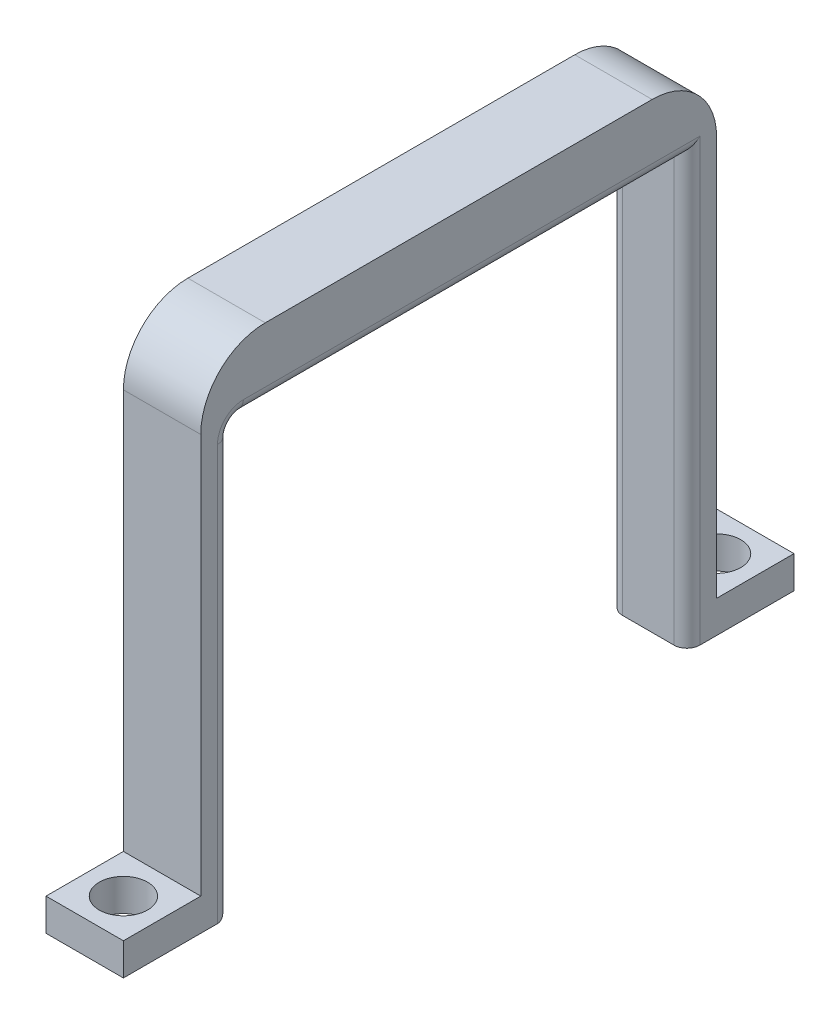
ISO-10303-21;
HEADER;
FILE_DESCRIPTION(('STEP AP214'),'2;1');
FILE_NAME('part.step','',(''),(''),'','','');
FILE_SCHEMA(('AUTOMOTIVE_DESIGN { 1 0 10303 214 1 1 1 1 }'));
ENDSEC;
DATA;
#1=APPLICATION_CONTEXT('core data for automotive mechanical design processes');
#2=APPLICATION_PROTOCOL_DEFINITION('international standard','automotive_design',2000,#1);
#3=PRODUCT_CONTEXT('',#1,'mechanical');
#4=PRODUCT('Part','Part','',(#3));
#5=PRODUCT_RELATED_PRODUCT_CATEGORY('part','',(#4));
#6=PRODUCT_DEFINITION_FORMATION('','',#4);
#7=PRODUCT_DEFINITION_CONTEXT('part definition',#1,'design');
#8=PRODUCT_DEFINITION('design','',#6,#7);
#9=PRODUCT_DEFINITION_SHAPE('','',#8);
#10=(LENGTH_UNIT() NAMED_UNIT(*) SI_UNIT(.MILLI.,.METRE.));
#11=(NAMED_UNIT(*) PLANE_ANGLE_UNIT() SI_UNIT($,.RADIAN.));
#12=(NAMED_UNIT(*) SI_UNIT($,.STERADIAN.) SOLID_ANGLE_UNIT());
#13=UNCERTAINTY_MEASURE_WITH_UNIT(LENGTH_MEASURE(1.E-05),#10,'distance_accuracy_value','');
#14=(GEOMETRIC_REPRESENTATION_CONTEXT(3) GLOBAL_UNCERTAINTY_ASSIGNED_CONTEXT((#13)) GLOBAL_UNIT_ASSIGNED_CONTEXT((#10,
#11,#12)) REPRESENTATION_CONTEXT('',''));
#15=CARTESIAN_POINT('',(0.,0.,0.));
#16=DIRECTION('',(0.,0.,1.));
#17=DIRECTION('',(1.,0.,0.));
#18=AXIS2_PLACEMENT_3D('',#15,#16,#17);
#19=CARTESIAN_POINT('',(15.24,0.,-21.082));
#20=DIRECTION('',(0.,0.,1.));
#21=DIRECTION('',(1.,0.,0.));
#22=AXIS2_PLACEMENT_3D('',#19,#20,#21);
#23=PLANE('',#22);
#24=DIRECTION('',(0.,1.,0.));
#25=VECTOR('',#24,1.);
#26=CARTESIAN_POINT('',(12.7,0.,-21.082));
#27=LINE('',#26,#25);
#28=CARTESIAN_POINT('',(12.7,81.748418695114,-21.082));
#29=VERTEX_POINT('',#28);
#30=CARTESIAN_POINT('',(12.7,2.54,-21.082));
#31=VERTEX_POINT('',#30);
#32=EDGE_CURVE('E364',#29,#31,#27,.F.);
#33=ORIENTED_EDGE('',*,*,#32,.T.);
#34=DIRECTION('',(-1.,0.,0.));
#35=VECTOR('',#34,1.);
#36=CARTESIAN_POINT('',(15.24,2.54,-21.082));
#37=LINE('',#36,#35);
#38=CARTESIAN_POINT('',(2.54,2.54,-21.082));
#39=VERTEX_POINT('',#38);
#40=EDGE_CURVE('E367',#31,#39,#37,.T.);
#41=ORIENTED_EDGE('',*,*,#40,.T.);
#42=DIRECTION('',(0.,1.,0.));
#43=VECTOR('',#42,1.);
#44=CARTESIAN_POINT('',(2.54,0.,-21.082));
#45=LINE('',#44,#43);
#46=CARTESIAN_POINT('',(2.54,81.748418695114,-21.082));
#47=VERTEX_POINT('',#46);
#48=EDGE_CURVE('E358',#39,#47,#45,.T.);
#49=ORIENTED_EDGE('',*,*,#48,.T.);
#50=DIRECTION('',(-1.,0.,0.));
#51=VECTOR('',#50,1.);
#52=CARTESIAN_POINT('',(15.24,81.748418695114,-21.082));
#53=LINE('',#52,#51);
#54=EDGE_CURVE('E361',#47,#29,#53,.F.);
#55=ORIENTED_EDGE('',*,*,#54,.T.);
#56=EDGE_LOOP('',(#33,#41,#49,#55));
#57=FACE_BOUND('',#56,.T.);
#58=ADVANCED_FACE('F46',(#57),#23,.F.);
#59=CARTESIAN_POINT('',(15.24,84.288418695114,0.));
#60=DIRECTION('',(0.,1.,0.));
#61=DIRECTION('',(0.,0.,1.));
#62=AXIS2_PLACEMENT_3D('',#59,#60,#61);
#63=PLANE('',#62);
#64=DIRECTION('',(-1.,0.,0.));
#65=VECTOR('',#64,1.);
#66=CARTESIAN_POINT('',(15.24,84.288418695114,-110.998));
#67=LINE('',#66,#65);
#68=CARTESIAN_POINT('',(12.7,84.288418695114,-110.998));
#69=VERTEX_POINT('',#68);
#70=CARTESIAN_POINT('',(2.54,84.288418695114,-110.998));
#71=VERTEX_POINT('',#70);
#72=EDGE_CURVE('E291',#69,#71,#67,.T.);
#73=ORIENTED_EDGE('',*,*,#72,.F.);
#74=DIRECTION('',(0.,0.,-1.));
#75=VECTOR('',#74,1.);
#76=CARTESIAN_POINT('',(12.7,84.288418695114,-21.082));
#77=LINE('',#76,#75);
#78=CARTESIAN_POINT('',(12.7,84.288418695114,-23.622));
#79=VERTEX_POINT('',#78);
#80=EDGE_CURVE('E342',#69,#79,#77,.F.);
#81=ORIENTED_EDGE('',*,*,#80,.T.);
#82=DIRECTION('',(-1.,0.,0.));
#83=VECTOR('',#82,1.);
#84=CARTESIAN_POINT('',(0.,84.288418695114,-23.622));
#85=LINE('',#84,#83);
#86=CARTESIAN_POINT('',(2.54,84.288418695114,-23.622));
#87=VERTEX_POINT('',#86);
#88=EDGE_CURVE('E336',#79,#87,#85,.T.);
#89=ORIENTED_EDGE('',*,*,#88,.T.);
#90=DIRECTION('',(0.,0.,-1.));
#91=VECTOR('',#90,1.);
#92=CARTESIAN_POINT('',(2.54,84.288418695114,0.));
#93=LINE('',#92,#91);
#94=EDGE_CURVE('E339',#87,#71,#93,.T.);
#95=ORIENTED_EDGE('',*,*,#94,.T.);
#96=EDGE_LOOP('',(#73,#81,#89,#95));
#97=FACE_BOUND('',#96,.T.);
#98=ADVANCED_FACE('F508',(#97),#63,.F.);
#99=CARTESIAN_POINT('',(15.24,0.,-110.998));
#100=DIRECTION('',(0.,0.,-1.));
#101=DIRECTION('',(0.,1.,0.));
#102=AXIS2_PLACEMENT_3D('',#99,#100,#101);
#103=PLANE('',#102);
#104=DIRECTION('',(-1.,0.,0.));
#105=VECTOR('',#104,1.);
#106=CARTESIAN_POINT('',(15.24,0.,-110.998));
#107=LINE('',#106,#105);
#108=CARTESIAN_POINT('',(12.7,0.,-110.998));
#109=VERTEX_POINT('',#108);
#110=CARTESIAN_POINT('',(2.54,0.,-110.998));
#111=VERTEX_POINT('',#110);
#112=EDGE_CURVE('E207',#109,#111,#107,.T.);
#113=ORIENTED_EDGE('',*,*,#112,.F.);
#114=DIRECTION('',(0.,-1.,0.));
#115=VECTOR('',#114,1.);
#116=CARTESIAN_POINT('',(12.7,84.288418695114,-110.998));
#117=LINE('',#116,#115);
#118=EDGE_CURVE('E11',#109,#69,#117,.F.);
#119=ORIENTED_EDGE('',*,*,#118,.T.);
#120=ORIENTED_EDGE('',*,*,#72,.T.);
#121=DIRECTION('',(0.,-1.,0.));
#122=VECTOR('',#121,1.);
#123=CARTESIAN_POINT('',(2.54,0.,-110.998));
#124=LINE('',#123,#122);
#125=EDGE_CURVE('E56',#71,#111,#124,.T.);
#126=ORIENTED_EDGE('',*,*,#125,.T.);
#127=EDGE_LOOP('',(#113,#119,#120,#126));
#128=FACE_BOUND('',#127,.T.);
#129=ADVANCED_FACE('F506',(#128),#103,.F.);
#130=CARTESIAN_POINT('',(15.24,0.,0.));
#131=DIRECTION('',(0.,1.,0.));
#132=DIRECTION('',(0.,0.,1.));
#133=AXIS2_PLACEMENT_3D('',#130,#131,#132);
#134=PLANE('',#133);
#135=CARTESIAN_POINT('',(7.62,0.,-124.46));
#136=DIRECTION('',(0.,1.,0.));
#137=DIRECTION('',(0.,0.,1.));
#138=AXIS2_PLACEMENT_3D('',#135,#136,#137);
#139=CIRCLE('',#138,4.7625);
#140=CARTESIAN_POINT('',(7.62,0.,-119.6975));
#141=VERTEX_POINT('',#140);
#142=EDGE_CURVE('E385',#141,#141,#139,.T.);
#143=ORIENTED_EDGE('',*,*,#142,.T.);
#144=EDGE_LOOP('',(#143));
#145=FACE_BOUND('',#144,.T.);
#146=DIRECTION('',(0.,0.,-1.));
#147=VECTOR('',#146,1.);
#148=CARTESIAN_POINT('',(15.24,0.,0.));
#149=LINE('',#148,#147);
#150=CARTESIAN_POINT('',(15.24,0.,-113.538));
#151=VERTEX_POINT('',#150);
#152=CARTESIAN_POINT('',(15.24,0.,-132.08));
#153=VERTEX_POINT('',#152);
#154=EDGE_CURVE('E184',#151,#153,#149,.T.);
#155=ORIENTED_EDGE('',*,*,#154,.F.);
#156=CARTESIAN_POINT('',(12.7,0.,-113.538));
#157=DIRECTION('',(0.,1.,0.));
#158=DIRECTION('',(0.,0.,1.));
#159=AXIS2_PLACEMENT_3D('',#156,#157,#158);
#160=CIRCLE('',#159,2.54);
#161=EDGE_CURVE('E70',#151,#109,#160,.F.);
#162=ORIENTED_EDGE('',*,*,#161,.T.);
#163=ORIENTED_EDGE('',*,*,#112,.T.);
#164=CARTESIAN_POINT('',(2.54,0.,-113.538));
#165=DIRECTION('',(0.,1.,0.));
#166=DIRECTION('',(0.,0.,1.));
#167=AXIS2_PLACEMENT_3D('',#164,#165,#166);
#168=CIRCLE('',#167,2.54);
#169=CARTESIAN_POINT('',(0.,0.,-113.538));
#170=VERTEX_POINT('',#169);
#171=EDGE_CURVE('E374',#111,#170,#168,.F.);
#172=ORIENTED_EDGE('',*,*,#171,.T.);
#173=DIRECTION('',(0.,0.,-1.));
#174=VECTOR('',#173,1.);
#175=CARTESIAN_POINT('',(0.,0.,0.));
#176=LINE('',#175,#174);
#177=CARTESIAN_POINT('',(0.,0.,-132.08));
#178=VERTEX_POINT('',#177);
#179=EDGE_CURVE('E202',#170,#178,#176,.T.);
#180=ORIENTED_EDGE('',*,*,#179,.T.);
#181=DIRECTION('',(-1.,0.,0.));
#182=VECTOR('',#181,1.);
#183=CARTESIAN_POINT('',(15.24,0.,-132.08));
#184=LINE('',#183,#182);
#185=EDGE_CURVE('E199',#153,#178,#184,.T.);
#186=ORIENTED_EDGE('',*,*,#185,.F.);
#187=EDGE_LOOP('',(#155,#162,#163,#172,#180,#186));
#188=FACE_BOUND('',#187,.T.);
#189=ADVANCED_FACE('F200',(#145,#188),#134,.F.);
#190=CARTESIAN_POINT('',(15.24,0.,-132.08));
#191=DIRECTION('',(0.,0.,1.));
#192=DIRECTION('',(1.,0.,0.));
#193=AXIS2_PLACEMENT_3D('',#190,#191,#192);
#194=PLANE('',#193);
#195=DIRECTION('',(0.,1.,0.));
#196=VECTOR('',#195,1.);
#197=CARTESIAN_POINT('',(0.,0.,-132.08));
#198=LINE('',#197,#196);
#199=CARTESIAN_POINT('',(0.,6.34999999999999,-132.08));
#200=VERTEX_POINT('',#199);
#201=EDGE_CURVE('E245',#178,#200,#198,.T.);
#202=ORIENTED_EDGE('',*,*,#201,.T.);
#203=DIRECTION('',(-1.,0.,0.));
#204=VECTOR('',#203,1.);
#205=CARTESIAN_POINT('',(15.24,6.34999999999999,-132.08));
#206=LINE('',#205,#204);
#207=CARTESIAN_POINT('',(15.24,6.34999999999999,-132.08));
#208=VERTEX_POINT('',#207);
#209=EDGE_CURVE('E208',#208,#200,#206,.T.);
#210=ORIENTED_EDGE('',*,*,#209,.F.);
#211=DIRECTION('',(0.,1.,0.));
#212=VECTOR('',#211,1.);
#213=CARTESIAN_POINT('',(15.24,0.,-132.08));
#214=LINE('',#213,#212);
#215=EDGE_CURVE('E190',#153,#208,#214,.T.);
#216=ORIENTED_EDGE('',*,*,#215,.F.);
#217=ORIENTED_EDGE('',*,*,#185,.T.);
#218=EDGE_LOOP('',(#202,#210,#216,#217));
#219=FACE_BOUND('',#218,.T.);
#220=ADVANCED_FACE('F210',(#219),#194,.F.);
#221=CARTESIAN_POINT('',(15.24,6.34999999999999,0.));
#222=DIRECTION('',(0.,1.,0.));
#223=DIRECTION('',(0.,0.,1.));
#224=AXIS2_PLACEMENT_3D('',#221,#222,#223);
#225=PLANE('',#224);
#226=CARTESIAN_POINT('',(7.62,6.34999999999999,-124.46));
#227=DIRECTION('',(0.,1.,0.));
#228=DIRECTION('',(0.,0.,1.));
#229=AXIS2_PLACEMENT_3D('',#226,#227,#228);
#230=CIRCLE('',#229,4.7625);
#231=CARTESIAN_POINT('',(7.62,6.34999999999999,-119.6975));
#232=VERTEX_POINT('',#231);
#233=EDGE_CURVE('E434',#232,#232,#230,.T.);
#234=ORIENTED_EDGE('',*,*,#233,.F.);
#235=EDGE_LOOP('',(#234));
#236=FACE_BOUND('',#235,.T.);
#237=DIRECTION('',(0.,0.,-1.));
#238=VECTOR('',#237,1.);
#239=CARTESIAN_POINT('',(0.,6.34999999999999,0.));
#240=LINE('',#239,#238);
#241=CARTESIAN_POINT('',(0.,6.34999999999999,-116.84));
#242=VERTEX_POINT('',#241);
#243=EDGE_CURVE('E249',#242,#200,#240,.T.);
#244=ORIENTED_EDGE('',*,*,#243,.F.);
#245=DIRECTION('',(-1.,0.,0.));
#246=VECTOR('',#245,1.);
#247=CARTESIAN_POINT('',(15.24,6.34999999999999,-116.84));
#248=LINE('',#247,#246);
#249=CARTESIAN_POINT('',(15.24,6.34999999999999,-116.84));
#250=VERTEX_POINT('',#249);
#251=EDGE_CURVE('E283',#250,#242,#248,.T.);
#252=ORIENTED_EDGE('',*,*,#251,.F.);
#253=DIRECTION('',(0.,0.,-1.));
#254=VECTOR('',#253,1.);
#255=CARTESIAN_POINT('',(15.24,6.34999999999999,0.));
#256=LINE('',#255,#254);
#257=EDGE_CURVE('E213',#250,#208,#256,.T.);
#258=ORIENTED_EDGE('',*,*,#257,.T.);
#259=ORIENTED_EDGE('',*,*,#209,.T.);
#260=EDGE_LOOP('',(#244,#252,#258,#259));
#261=FACE_BOUND('',#260,.T.);
#262=ADVANCED_FACE('F443',(#236,#261),#225,.T.);
#263=CARTESIAN_POINT('',(15.24,0.,-116.84));
#264=DIRECTION('',(0.,0.,-1.));
#265=DIRECTION('',(0.,1.,0.));
#266=AXIS2_PLACEMENT_3D('',#263,#264,#265);
#267=PLANE('',#266);
#268=DIRECTION('',(0.,-1.,0.));
#269=VECTOR('',#268,1.);
#270=CARTESIAN_POINT('',(0.,0.,-116.84));
#271=LINE('',#270,#269);
#272=CARTESIAN_POINT('',(0.,85.09,-116.84));
#273=VERTEX_POINT('',#272);
#274=EDGE_CURVE('E253',#273,#242,#271,.T.);
#275=ORIENTED_EDGE('',*,*,#274,.F.);
#276=DIRECTION('',(-1.,0.,0.));
#277=VECTOR('',#276,1.);
#278=CARTESIAN_POINT('',(15.24,85.09,-116.84));
#279=LINE('',#278,#277);
#280=CARTESIAN_POINT('',(15.24,85.09,-116.84));
#281=VERTEX_POINT('',#280);
#282=EDGE_CURVE('E307',#273,#281,#279,.F.);
#283=ORIENTED_EDGE('',*,*,#282,.T.);
#284=DIRECTION('',(0.,-1.,0.));
#285=VECTOR('',#284,1.);
#286=CARTESIAN_POINT('',(15.24,0.,-116.84));
#287=LINE('',#286,#285);
#288=EDGE_CURVE('E217',#281,#250,#287,.T.);
#289=ORIENTED_EDGE('',*,*,#288,.T.);
#290=ORIENTED_EDGE('',*,*,#251,.T.);
#291=EDGE_LOOP('',(#275,#283,#289,#290));
#292=FACE_BOUND('',#291,.T.);
#293=ADVANCED_FACE('F446',(#292),#267,.T.);
#294=CARTESIAN_POINT('',(15.24,97.79,0.));
#295=DIRECTION('',(0.,1.,0.));
#296=DIRECTION('',(0.,0.,1.));
#297=AXIS2_PLACEMENT_3D('',#294,#295,#296);
#298=PLANE('',#297);
#299=DIRECTION('',(0.,0.,-1.));
#300=VECTOR('',#299,1.);
#301=CARTESIAN_POINT('',(15.24,97.79,0.));
#302=LINE('',#301,#300);
#303=CARTESIAN_POINT('',(15.24,97.79,-27.94));
#304=VERTEX_POINT('',#303);
#305=CARTESIAN_POINT('',(15.24,97.79,-104.14));
#306=VERTEX_POINT('',#305);
#307=EDGE_CURVE('E223',#304,#306,#302,.T.);
#308=ORIENTED_EDGE('',*,*,#307,.T.);
#309=DIRECTION('',(-1.,0.,0.));
#310=VECTOR('',#309,1.);
#311=CARTESIAN_POINT('',(15.24,97.79,-104.14));
#312=LINE('',#311,#310);
#313=CARTESIAN_POINT('',(0.,97.79,-104.14));
#314=VERTEX_POINT('',#313);
#315=EDGE_CURVE('E297',#306,#314,#312,.T.);
#316=ORIENTED_EDGE('',*,*,#315,.T.);
#317=DIRECTION('',(0.,0.,-1.));
#318=VECTOR('',#317,1.);
#319=CARTESIAN_POINT('',(0.,97.79,0.));
#320=LINE('',#319,#318);
#321=CARTESIAN_POINT('',(0.,97.79,-27.94));
#322=VERTEX_POINT('',#321);
#323=EDGE_CURVE('E256',#322,#314,#320,.T.);
#324=ORIENTED_EDGE('',*,*,#323,.F.);
#325=DIRECTION('',(-1.,0.,0.));
#326=VECTOR('',#325,1.);
#327=CARTESIAN_POINT('',(15.24,97.79,-27.94));
#328=LINE('',#327,#326);
#329=EDGE_CURVE('E294',#322,#304,#328,.F.);
#330=ORIENTED_EDGE('',*,*,#329,.T.);
#331=EDGE_LOOP('',(#308,#316,#324,#330));
#332=FACE_BOUND('',#331,.T.);
#333=ADVANCED_FACE('F463',(#332),#298,.T.);
#334=CARTESIAN_POINT('',(15.24,0.,-15.24));
#335=DIRECTION('',(0.,0.,1.));
#336=DIRECTION('',(1.,0.,0.));
#337=AXIS2_PLACEMENT_3D('',#334,#335,#336);
#338=PLANE('',#337);
#339=DIRECTION('',(0.,1.,0.));
#340=VECTOR('',#339,1.);
#341=CARTESIAN_POINT('',(15.24,0.,-15.24));
#342=LINE('',#341,#340);
#343=CARTESIAN_POINT('',(15.24,6.34999999999999,-15.24));
#344=VERTEX_POINT('',#343);
#345=CARTESIAN_POINT('',(15.24,85.09,-15.24));
#346=VERTEX_POINT('',#345);
#347=EDGE_CURVE('E227',#344,#346,#342,.T.);
#348=ORIENTED_EDGE('',*,*,#347,.T.);
#349=DIRECTION('',(-1.,0.,0.));
#350=VECTOR('',#349,1.);
#351=CARTESIAN_POINT('',(15.24,85.09,-15.24));
#352=LINE('',#351,#350);
#353=CARTESIAN_POINT('',(0.,85.09,-15.24));
#354=VERTEX_POINT('',#353);
#355=EDGE_CURVE('E316',#346,#354,#352,.T.);
#356=ORIENTED_EDGE('',*,*,#355,.T.);
#357=DIRECTION('',(0.,1.,0.));
#358=VECTOR('',#357,1.);
#359=CARTESIAN_POINT('',(0.,0.,-15.24));
#360=LINE('',#359,#358);
#361=CARTESIAN_POINT('',(0.,6.34999999999999,-15.24));
#362=VERTEX_POINT('',#361);
#363=EDGE_CURVE('E260',#362,#354,#360,.T.);
#364=ORIENTED_EDGE('',*,*,#363,.F.);
#365=DIRECTION('',(-1.,0.,0.));
#366=VECTOR('',#365,1.);
#367=CARTESIAN_POINT('',(15.24,6.34999999999999,-15.24));
#368=LINE('',#367,#366);
#369=EDGE_CURVE('E280',#344,#362,#368,.T.);
#370=ORIENTED_EDGE('',*,*,#369,.F.);
#371=EDGE_LOOP('',(#348,#356,#364,#370));
#372=FACE_BOUND('',#371,.T.);
#373=ADVANCED_FACE('F471',(#372),#338,.T.);
#374=CARTESIAN_POINT('',(15.24,6.34999999999999,0.));
#375=DIRECTION('',(0.,1.,0.));
#376=DIRECTION('',(0.,0.,1.));
#377=AXIS2_PLACEMENT_3D('',#374,#375,#376);
#378=PLANE('',#377);
#379=CARTESIAN_POINT('',(7.62,6.34999999999999,-7.62));
#380=DIRECTION('',(0.,1.,0.));
#381=DIRECTION('',(0.,0.,1.));
#382=AXIS2_PLACEMENT_3D('',#379,#380,#381);
#383=CIRCLE('',#382,4.7625);
#384=CARTESIAN_POINT('',(7.62,6.34999999999999,-2.8575));
#385=VERTEX_POINT('',#384);
#386=EDGE_CURVE('E323',#385,#385,#383,.T.);
#387=ORIENTED_EDGE('',*,*,#386,.F.);
#388=EDGE_LOOP('',(#387));
#389=FACE_BOUND('',#388,.T.);
#390=DIRECTION('',(0.,0.,-1.));
#391=VECTOR('',#390,1.);
#392=CARTESIAN_POINT('',(0.,6.34999999999999,0.));
#393=LINE('',#392,#391);
#394=CARTESIAN_POINT('',(0.,6.34999999999999,0.));
#395=VERTEX_POINT('',#394);
#396=EDGE_CURVE('E264',#395,#362,#393,.T.);
#397=ORIENTED_EDGE('',*,*,#396,.F.);
#398=DIRECTION('',(-1.,0.,0.));
#399=VECTOR('',#398,1.);
#400=CARTESIAN_POINT('',(15.24,6.34999999999999,0.));
#401=LINE('',#400,#399);
#402=CARTESIAN_POINT('',(15.24,6.34999999999999,0.));
#403=VERTEX_POINT('',#402);
#404=EDGE_CURVE('E277',#403,#395,#401,.T.);
#405=ORIENTED_EDGE('',*,*,#404,.F.);
#406=DIRECTION('',(0.,0.,-1.));
#407=VECTOR('',#406,1.);
#408=CARTESIAN_POINT('',(15.24,6.34999999999999,0.));
#409=LINE('',#408,#407);
#410=EDGE_CURVE('E231',#403,#344,#409,.T.);
#411=ORIENTED_EDGE('',*,*,#410,.T.);
#412=ORIENTED_EDGE('',*,*,#369,.T.);
#413=EDGE_LOOP('',(#397,#405,#411,#412));
#414=FACE_BOUND('',#413,.T.);
#415=ADVANCED_FACE('F477',(#389,#414),#378,.T.);
#416=CARTESIAN_POINT('',(15.24,0.,0.));
#417=DIRECTION('',(0.,0.,1.));
#418=DIRECTION('',(1.,0.,0.));
#419=AXIS2_PLACEMENT_3D('',#416,#417,#418);
#420=PLANE('',#419);
#421=DIRECTION('',(0.,1.,0.));
#422=VECTOR('',#421,1.);
#423=CARTESIAN_POINT('',(0.,0.,0.));
#424=LINE('',#423,#422);
#425=CARTESIAN_POINT('',(0.,0.,0.));
#426=VERTEX_POINT('',#425);
#427=EDGE_CURVE('E268',#426,#395,#424,.T.);
#428=ORIENTED_EDGE('',*,*,#427,.F.);
#429=DIRECTION('',(-1.,0.,0.));
#430=VECTOR('',#429,1.);
#431=CARTESIAN_POINT('',(15.24,0.,0.));
#432=LINE('',#431,#430);
#433=CARTESIAN_POINT('',(15.24,0.,0.));
#434=VERTEX_POINT('',#433);
#435=EDGE_CURVE('E242',#434,#426,#432,.T.);
#436=ORIENTED_EDGE('',*,*,#435,.F.);
#437=DIRECTION('',(0.,1.,0.));
#438=VECTOR('',#437,1.);
#439=CARTESIAN_POINT('',(15.24,0.,0.));
#440=LINE('',#439,#438);
#441=EDGE_CURVE('E235',#434,#403,#440,.T.);
#442=ORIENTED_EDGE('',*,*,#441,.T.);
#443=ORIENTED_EDGE('',*,*,#404,.T.);
#444=EDGE_LOOP('',(#428,#436,#442,#443));
#445=FACE_BOUND('',#444,.T.);
#446=ADVANCED_FACE('F480',(#445),#420,.T.);
#447=CARTESIAN_POINT('',(15.24,0.,0.));
#448=DIRECTION('',(0.,1.,0.));
#449=DIRECTION('',(0.,0.,1.));
#450=AXIS2_PLACEMENT_3D('',#447,#448,#449);
#451=PLANE('',#450);
#452=CARTESIAN_POINT('',(7.62,0.,-7.62));
#453=DIRECTION('',(0.,1.,0.));
#454=DIRECTION('',(0.,0.,1.));
#455=AXIS2_PLACEMENT_3D('',#452,#453,#454);
#456=CIRCLE('',#455,4.7625);
#457=CARTESIAN_POINT('',(7.62,0.,-2.8575));
#458=VERTEX_POINT('',#457);
#459=EDGE_CURVE('E246',#458,#458,#456,.T.);
#460=ORIENTED_EDGE('',*,*,#459,.T.);
#461=EDGE_LOOP('',(#460));
#462=FACE_BOUND('',#461,.T.);
#463=DIRECTION('',(0.,0.,-1.));
#464=VECTOR('',#463,1.);
#465=CARTESIAN_POINT('',(0.,0.,0.));
#466=LINE('',#465,#464);
#467=CARTESIAN_POINT('',(0.,0.,-18.542));
#468=VERTEX_POINT('',#467);
#469=EDGE_CURVE('E196',#426,#468,#466,.T.);
#470=ORIENTED_EDGE('',*,*,#469,.T.);
#471=DIRECTION('',(-1.,0.,0.));
#472=VECTOR('',#471,1.);
#473=CARTESIAN_POINT('',(15.24,0.,-18.542));
#474=LINE('',#473,#472);
#475=CARTESIAN_POINT('',(15.24,0.,-18.542));
#476=VERTEX_POINT('',#475);
#477=EDGE_CURVE('E371',#468,#476,#474,.F.);
#478=ORIENTED_EDGE('',*,*,#477,.T.);
#479=DIRECTION('',(0.,0.,-1.));
#480=VECTOR('',#479,1.);
#481=CARTESIAN_POINT('',(15.24,0.,0.));
#482=LINE('',#481,#480);
#483=EDGE_CURVE('E239',#434,#476,#482,.T.);
#484=ORIENTED_EDGE('',*,*,#483,.F.);
#485=ORIENTED_EDGE('',*,*,#435,.T.);
#486=EDGE_LOOP('',(#470,#478,#484,#485));
#487=FACE_BOUND('',#486,.T.);
#488=ADVANCED_FACE('F609',(#462,#487),#451,.F.);
#489=CARTESIAN_POINT('',(15.24,0.,0.));
#490=DIRECTION('',(1.,0.,0.));
#491=DIRECTION('',(0.,0.,-1.));
#492=AXIS2_PLACEMENT_3D('',#489,#490,#491);
#493=PLANE('',#492);
#494=ORIENTED_EDGE('',*,*,#483,.T.);
#495=DIRECTION('',(0.,1.,0.));
#496=VECTOR('',#495,1.);
#497=CARTESIAN_POINT('',(15.24,84.288418695114,-18.542));
#498=LINE('',#497,#496);
#499=CARTESIAN_POINT('',(15.24,81.748418695114,-18.542));
#500=VERTEX_POINT('',#499);
#501=EDGE_CURVE('E333',#476,#500,#498,.T.);
#502=ORIENTED_EDGE('',*,*,#501,.T.);
#503=CARTESIAN_POINT('',(15.24,81.748418695114,-23.622));
#504=DIRECTION('',(1.,0.,0.));
#505=DIRECTION('',(0.,0.,-1.));
#506=AXIS2_PLACEMENT_3D('',#503,#504,#505);
#507=CIRCLE('',#506,5.08);
#508=CARTESIAN_POINT('',(15.24,86.828418695114,-23.622));
#509=VERTEX_POINT('',#508);
#510=EDGE_CURVE('E329',#509,#500,#507,.T.);
#511=ORIENTED_EDGE('',*,*,#510,.F.);
#512=DIRECTION('',(0.,0.,-1.));
#513=VECTOR('',#512,1.);
#514=CARTESIAN_POINT('',(15.24,86.8284186951141,-110.998));
#515=LINE('',#514,#513);
#516=CARTESIAN_POINT('',(15.24,86.8284186951141,-113.538));
#517=VERTEX_POINT('',#516);
#518=EDGE_CURVE('E326',#509,#517,#515,.T.);
#519=ORIENTED_EDGE('',*,*,#518,.T.);
#520=DIRECTION('',(0.,-1.,0.));
#521=VECTOR('',#520,1.);
#522=CARTESIAN_POINT('',(15.24,0.,-113.538));
#523=LINE('',#522,#521);
#524=EDGE_CURVE('E194',#517,#151,#523,.T.);
#525=ORIENTED_EDGE('',*,*,#524,.T.);
#526=ORIENTED_EDGE('',*,*,#154,.T.);
#527=ORIENTED_EDGE('',*,*,#215,.T.);
#528=ORIENTED_EDGE('',*,*,#257,.F.);
#529=ORIENTED_EDGE('',*,*,#288,.F.);
#530=CARTESIAN_POINT('',(15.24,85.09,-104.14));
#531=DIRECTION('',(1.,0.,0.));
#532=DIRECTION('',(0.,0.,-1.));
#533=AXIS2_PLACEMENT_3D('',#530,#531,#532);
#534=CIRCLE('',#533,12.7);
#535=EDGE_CURVE('E313',#281,#306,#534,.T.);
#536=ORIENTED_EDGE('',*,*,#535,.T.);
#537=ORIENTED_EDGE('',*,*,#307,.F.);
#538=CARTESIAN_POINT('',(15.24,85.09,-27.94));
#539=DIRECTION('',(1.,0.,0.));
#540=DIRECTION('',(0.,0.,-1.));
#541=AXIS2_PLACEMENT_3D('',#538,#539,#540);
#542=CIRCLE('',#541,12.7);
#543=EDGE_CURVE('E310',#304,#346,#542,.T.);
#544=ORIENTED_EDGE('',*,*,#543,.T.);
#545=ORIENTED_EDGE('',*,*,#347,.F.);
#546=ORIENTED_EDGE('',*,*,#410,.F.);
#547=ORIENTED_EDGE('',*,*,#441,.F.);
#548=EDGE_LOOP('',(#494,#502,#511,#519,#525,#526,#527,#528,#529,#536,#537,#544,#545,#546,#547));
#549=FACE_BOUND('',#548,.T.);
#550=ADVANCED_FACE('F187',(#549),#493,.T.);
#551=CARTESIAN_POINT('',(0.,0.,0.));
#552=DIRECTION('',(1.,0.,0.));
#553=DIRECTION('',(0.,0.,-1.));
#554=AXIS2_PLACEMENT_3D('',#551,#552,#553);
#555=PLANE('',#554);
#556=CARTESIAN_POINT('',(0.,81.748418695114,-23.622));
#557=DIRECTION('',(1.,0.,0.));
#558=DIRECTION('',(0.,0.,-1.));
#559=AXIS2_PLACEMENT_3D('',#556,#557,#558);
#560=CIRCLE('',#559,5.08);
#561=CARTESIAN_POINT('',(0.,81.748418695114,-18.542));
#562=VERTEX_POINT('',#561);
#563=CARTESIAN_POINT('',(0.,86.828418695114,-23.622));
#564=VERTEX_POINT('',#563);
#565=EDGE_CURVE('E351',#562,#564,#560,.F.);
#566=ORIENTED_EDGE('',*,*,#565,.F.);
#567=DIRECTION('',(0.,1.,0.));
#568=VECTOR('',#567,1.);
#569=CARTESIAN_POINT('',(0.,0.,-18.542));
#570=LINE('',#569,#568);
#571=EDGE_CURVE('E355',#562,#468,#570,.F.);
#572=ORIENTED_EDGE('',*,*,#571,.T.);
#573=ORIENTED_EDGE('',*,*,#469,.F.);
#574=ORIENTED_EDGE('',*,*,#427,.T.);
#575=ORIENTED_EDGE('',*,*,#396,.T.);
#576=ORIENTED_EDGE('',*,*,#363,.T.);
#577=CARTESIAN_POINT('',(0.,85.09,-27.94));
#578=DIRECTION('',(1.,0.,0.));
#579=DIRECTION('',(0.,0.,-1.));
#580=AXIS2_PLACEMENT_3D('',#577,#578,#579);
#581=CIRCLE('',#580,12.7);
#582=EDGE_CURVE('E301',#354,#322,#581,.F.);
#583=ORIENTED_EDGE('',*,*,#582,.T.);
#584=ORIENTED_EDGE('',*,*,#323,.T.);
#585=CARTESIAN_POINT('',(0.,85.09,-104.14));
#586=DIRECTION('',(1.,0.,0.));
#587=DIRECTION('',(0.,0.,-1.));
#588=AXIS2_PLACEMENT_3D('',#585,#586,#587);
#589=CIRCLE('',#588,12.7);
#590=EDGE_CURVE('E304',#314,#273,#589,.F.);
#591=ORIENTED_EDGE('',*,*,#590,.T.);
#592=ORIENTED_EDGE('',*,*,#274,.T.);
#593=ORIENTED_EDGE('',*,*,#243,.T.);
#594=ORIENTED_EDGE('',*,*,#201,.F.);
#595=ORIENTED_EDGE('',*,*,#179,.F.);
#596=DIRECTION('',(0.,-1.,0.));
#597=VECTOR('',#596,1.);
#598=CARTESIAN_POINT('',(0.,0.,-113.538));
#599=LINE('',#598,#597);
#600=CARTESIAN_POINT('',(0.,86.8284186951141,-113.538));
#601=VERTEX_POINT('',#600);
#602=EDGE_CURVE('E345',#170,#601,#599,.F.);
#603=ORIENTED_EDGE('',*,*,#602,.T.);
#604=DIRECTION('',(0.,0.,-1.));
#605=VECTOR('',#604,1.);
#606=CARTESIAN_POINT('',(0.,86.828418695114,0.));
#607=LINE('',#606,#605);
#608=EDGE_CURVE('E348',#601,#564,#607,.F.);
#609=ORIENTED_EDGE('',*,*,#608,.T.);
#610=EDGE_LOOP('',(#566,#572,#573,#574,#575,#576,#583,#584,#591,#592,#593,#594,#595,#603,#609));
#611=FACE_BOUND('',#610,.T.);
#612=ADVANCED_FACE('F451',(#611),#555,.F.);
#613=CARTESIAN_POINT('',(15.24,85.09,-104.14));
#614=DIRECTION('',(-1.,0.,0.));
#615=DIRECTION('',(0.,0.,1.));
#616=AXIS2_PLACEMENT_3D('',#613,#614,#615);
#617=CYLINDRICAL_SURFACE('',#616,12.7);
#618=ORIENTED_EDGE('',*,*,#535,.F.);
#619=ORIENTED_EDGE('',*,*,#282,.F.);
#620=ORIENTED_EDGE('',*,*,#590,.F.);
#621=ORIENTED_EDGE('',*,*,#315,.F.);
#622=EDGE_LOOP('',(#618,#619,#620,#621));
#623=FACE_BOUND('',#622,.T.);
#624=ADVANCED_FACE('F460',(#623),#617,.T.);
#625=CARTESIAN_POINT('',(15.24,85.09,-27.94));
#626=DIRECTION('',(-1.,0.,0.));
#627=DIRECTION('',(0.,0.,1.));
#628=AXIS2_PLACEMENT_3D('',#625,#626,#627);
#629=CYLINDRICAL_SURFACE('',#628,12.7);
#630=ORIENTED_EDGE('',*,*,#543,.F.);
#631=ORIENTED_EDGE('',*,*,#329,.F.);
#632=ORIENTED_EDGE('',*,*,#582,.F.);
#633=ORIENTED_EDGE('',*,*,#355,.F.);
#634=EDGE_LOOP('',(#630,#631,#632,#633));
#635=FACE_BOUND('',#634,.T.);
#636=ADVANCED_FACE('F469',(#635),#629,.T.);
#637=CARTESIAN_POINT('',(7.62,-11.43,-7.62));
#638=DIRECTION('',(0.,1.,0.));
#639=DIRECTION('',(0.,0.,1.));
#640=AXIS2_PLACEMENT_3D('',#637,#638,#639);
#641=CYLINDRICAL_SURFACE('',#640,4.7625);
#642=ORIENTED_EDGE('',*,*,#386,.T.);
#643=EDGE_LOOP('',(#642));
#644=FACE_BOUND('',#643,.T.);
#645=ORIENTED_EDGE('',*,*,#459,.F.);
#646=EDGE_LOOP('',(#645));
#647=FACE_BOUND('',#646,.T.);
#648=ADVANCED_FACE('F543',(#644,#647),#641,.F.);
#649=CARTESIAN_POINT('',(2.54,0.,-113.538));
#650=DIRECTION('',(0.,-1.,0.));
#651=DIRECTION('',(0.,0.,-1.));
#652=AXIS2_PLACEMENT_3D('',#649,#650,#651);
#653=CYLINDRICAL_SURFACE('',#652,2.54);
#654=ORIENTED_EDGE('',*,*,#171,.F.);
#655=ORIENTED_EDGE('',*,*,#125,.F.);
#656=CARTESIAN_POINT('',(2.54,86.8284186951141,-113.538));
#657=DIRECTION('',(0.,-0.707106781186547,-0.707106781186548));
#658=DIRECTION('',(0.,0.707106781186548,-0.707106781186547));
#659=AXIS2_PLACEMENT_3D('',#656,#657,#658);
#660=ELLIPSE('',#659,3.59210244842766,2.54);
#661=EDGE_CURVE('E50',#601,#71,#660,.F.);
#662=ORIENTED_EDGE('',*,*,#661,.F.);
#663=ORIENTED_EDGE('',*,*,#602,.F.);
#664=EDGE_LOOP('',(#654,#655,#662,#663));
#665=FACE_BOUND('',#664,.T.);
#666=ADVANCED_FACE('F48',(#665),#653,.T.);
#667=CARTESIAN_POINT('',(2.54,86.828418695114,0.));
#668=DIRECTION('',(0.,0.,-1.));
#669=DIRECTION('',(0.,1.,0.));
#670=AXIS2_PLACEMENT_3D('',#667,#668,#669);
#671=CYLINDRICAL_SURFACE('',#670,2.54);
#672=ORIENTED_EDGE('',*,*,#661,.T.);
#673=ORIENTED_EDGE('',*,*,#94,.F.);
#674=CARTESIAN_POINT('',(2.54,86.828418695114,-23.622));
#675=DIRECTION('',(0.,0.,1.));
#676=DIRECTION('',(1.,0.,0.));
#677=AXIS2_PLACEMENT_3D('',#674,#675,#676);
#678=CIRCLE('',#677,2.54);
#679=EDGE_CURVE('E411',#564,#87,#678,.T.);
#680=ORIENTED_EDGE('',*,*,#679,.F.);
#681=ORIENTED_EDGE('',*,*,#608,.F.);
#682=EDGE_LOOP('',(#672,#673,#680,#681));
#683=FACE_BOUND('',#682,.T.);
#684=ADVANCED_FACE('F510',(#683),#671,.T.);
#685=CARTESIAN_POINT('',(2.54,0.,-18.542));
#686=DIRECTION('',(0.,1.,0.));
#687=DIRECTION('',(0.,0.,1.));
#688=AXIS2_PLACEMENT_3D('',#685,#686,#687);
#689=CYLINDRICAL_SURFACE('',#688,2.54);
#690=CARTESIAN_POINT('',(2.54,2.54,-18.542));
#691=DIRECTION('',(-0.707106781186547,0.707106781186547,0.));
#692=DIRECTION('',(0.707106781186547,0.707106781186547,0.));
#693=AXIS2_PLACEMENT_3D('',#690,#691,#692);
#694=ELLIPSE('',#693,3.59210244842766,2.54);
#695=EDGE_CURVE('E405',#468,#39,#694,.F.);
#696=ORIENTED_EDGE('',*,*,#695,.F.);
#697=ORIENTED_EDGE('',*,*,#571,.F.);
#698=CARTESIAN_POINT('',(2.54,81.748418695114,-18.542));
#699=DIRECTION('',(0.,1.,0.));
#700=DIRECTION('',(0.,0.,1.));
#701=AXIS2_PLACEMENT_3D('',#698,#699,#700);
#702=CIRCLE('',#701,2.54);
#703=EDGE_CURVE('E408',#47,#562,#702,.T.);
#704=ORIENTED_EDGE('',*,*,#703,.F.);
#705=ORIENTED_EDGE('',*,*,#48,.F.);
#706=EDGE_LOOP('',(#696,#697,#704,#705));
#707=FACE_BOUND('',#706,.T.);
#708=ADVANCED_FACE('F517',(#707),#689,.T.);
#709=CARTESIAN_POINT('',(2.54,81.748418695114,-23.622));
#710=DIRECTION('',(1.,0.,0.));
#711=DIRECTION('',(0.,0.,-1.));
#712=AXIS2_PLACEMENT_3D('',#709,#710,#711);
#713=TOROIDAL_SURFACE('',#712,5.08,2.54);
#714=ORIENTED_EDGE('',*,*,#565,.T.);
#715=ORIENTED_EDGE('',*,*,#679,.T.);
#716=CARTESIAN_POINT('',(2.54,81.748418695114,-23.622));
#717=DIRECTION('',(1.,0.,0.));
#718=DIRECTION('',(0.,0.,-1.));
#719=AXIS2_PLACEMENT_3D('',#716,#717,#718);
#720=CIRCLE('',#719,2.54);
#721=EDGE_CURVE('E401',#47,#87,#720,.F.);
#722=ORIENTED_EDGE('',*,*,#721,.F.);
#723=ORIENTED_EDGE('',*,*,#703,.T.);
#724=EDGE_LOOP('',(#714,#715,#722,#723));
#725=FACE_BOUND('',#724,.T.);
#726=ADVANCED_FACE('F511',(#725),#713,.T.);
#727=CARTESIAN_POINT('',(15.24,2.54,-18.542));
#728=DIRECTION('',(-1.,0.,0.));
#729=DIRECTION('',(0.,0.,1.));
#730=AXIS2_PLACEMENT_3D('',#727,#728,#729);
#731=CYLINDRICAL_SURFACE('',#730,2.54);
#732=ORIENTED_EDGE('',*,*,#695,.T.);
#733=ORIENTED_EDGE('',*,*,#40,.F.);
#734=CARTESIAN_POINT('',(12.7,2.54,-18.542));
#735=DIRECTION('',(-0.707106781186547,-0.707106781186547,0.));
#736=DIRECTION('',(0.707106781186547,-0.707106781186547,0.));
#737=AXIS2_PLACEMENT_3D('',#734,#735,#736);
#738=ELLIPSE('',#737,3.59210244842766,2.54);
#739=EDGE_CURVE('E397',#476,#31,#738,.F.);
#740=ORIENTED_EDGE('',*,*,#739,.F.);
#741=ORIENTED_EDGE('',*,*,#477,.F.);
#742=EDGE_LOOP('',(#732,#733,#740,#741));
#743=FACE_BOUND('',#742,.T.);
#744=ADVANCED_FACE('F489',(#743),#731,.T.);
#745=CARTESIAN_POINT('',(15.24,81.748418695114,-23.622));
#746=DIRECTION('',(1.,0.,0.));
#747=DIRECTION('',(0.,0.,-1.));
#748=AXIS2_PLACEMENT_3D('',#745,#746,#747);
#749=CYLINDRICAL_SURFACE('',#748,2.54);
#750=ORIENTED_EDGE('',*,*,#721,.T.);
#751=ORIENTED_EDGE('',*,*,#88,.F.);
#752=CARTESIAN_POINT('',(12.7,81.748418695114,-23.622));
#753=DIRECTION('',(1.,0.,0.));
#754=DIRECTION('',(0.,0.,-1.));
#755=AXIS2_PLACEMENT_3D('',#752,#753,#754);
#756=CIRCLE('',#755,2.54);
#757=EDGE_CURVE('E393',#29,#79,#756,.F.);
#758=ORIENTED_EDGE('',*,*,#757,.F.);
#759=ORIENTED_EDGE('',*,*,#54,.F.);
#760=EDGE_LOOP('',(#750,#751,#758,#759));
#761=FACE_BOUND('',#760,.T.);
#762=ADVANCED_FACE('F522',(#761),#749,.F.);
#763=CARTESIAN_POINT('',(12.7,0.,-18.542));
#764=DIRECTION('',(0.,-1.,0.));
#765=DIRECTION('',(0.,0.,-1.));
#766=AXIS2_PLACEMENT_3D('',#763,#764,#765);
#767=CYLINDRICAL_SURFACE('',#766,2.54);
#768=ORIENTED_EDGE('',*,*,#739,.T.);
#769=ORIENTED_EDGE('',*,*,#32,.F.);
#770=CARTESIAN_POINT('',(12.7,81.748418695114,-18.542));
#771=DIRECTION('',(0.,1.,0.));
#772=DIRECTION('',(0.,0.,1.));
#773=AXIS2_PLACEMENT_3D('',#770,#771,#772);
#774=CIRCLE('',#773,2.54);
#775=EDGE_CURVE('E389',#500,#29,#774,.T.);
#776=ORIENTED_EDGE('',*,*,#775,.F.);
#777=ORIENTED_EDGE('',*,*,#501,.F.);
#778=EDGE_LOOP('',(#768,#769,#776,#777));
#779=FACE_BOUND('',#778,.T.);
#780=ADVANCED_FACE('F492',(#779),#767,.T.);
#781=CARTESIAN_POINT('',(12.7,81.748418695114,-23.622));
#782=DIRECTION('',(1.,0.,0.));
#783=DIRECTION('',(0.,0.,-1.));
#784=AXIS2_PLACEMENT_3D('',#781,#782,#783);
#785=TOROIDAL_SURFACE('',#784,5.08,2.54);
#786=ORIENTED_EDGE('',*,*,#775,.T.);
#787=ORIENTED_EDGE('',*,*,#757,.T.);
#788=CARTESIAN_POINT('',(12.7,86.828418695114,-23.622));
#789=DIRECTION('',(0.,0.,1.));
#790=DIRECTION('',(1.,0.,0.));
#791=AXIS2_PLACEMENT_3D('',#788,#789,#790);
#792=CIRCLE('',#791,2.54);
#793=EDGE_CURVE('E384',#509,#79,#792,.F.);
#794=ORIENTED_EDGE('',*,*,#793,.F.);
#795=ORIENTED_EDGE('',*,*,#510,.T.);
#796=EDGE_LOOP('',(#786,#787,#794,#795));
#797=FACE_BOUND('',#796,.T.);
#798=ADVANCED_FACE('F496',(#797),#785,.T.);
#799=CARTESIAN_POINT('',(12.7,0.,-113.538));
#800=DIRECTION('',(0.,1.,0.));
#801=DIRECTION('',(0.,0.,1.));
#802=AXIS2_PLACEMENT_3D('',#799,#800,#801);
#803=CYLINDRICAL_SURFACE('',#802,2.54);
#804=ORIENTED_EDGE('',*,*,#161,.F.);
#805=ORIENTED_EDGE('',*,*,#524,.F.);
#806=CARTESIAN_POINT('',(12.7,86.8284186951141,-113.538));
#807=DIRECTION('',(0.,0.707106781186547,0.707106781186548));
#808=DIRECTION('',(0.,-0.707106781186548,0.707106781186547));
#809=AXIS2_PLACEMENT_3D('',#806,#807,#808);
#810=ELLIPSE('',#809,3.59210244842766,2.54);
#811=EDGE_CURVE('E381',#69,#517,#810,.T.);
#812=ORIENTED_EDGE('',*,*,#811,.F.);
#813=ORIENTED_EDGE('',*,*,#118,.F.);
#814=EDGE_LOOP('',(#804,#805,#812,#813));
#815=FACE_BOUND('',#814,.T.);
#816=ADVANCED_FACE('F504',(#815),#803,.T.);
#817=CARTESIAN_POINT('',(12.7,86.828418695114,0.));
#818=DIRECTION('',(0.,0.,1.));
#819=DIRECTION('',(0.,-1.,0.));
#820=AXIS2_PLACEMENT_3D('',#817,#818,#819);
#821=CYLINDRICAL_SURFACE('',#820,2.54);
#822=ORIENTED_EDGE('',*,*,#793,.T.);
#823=ORIENTED_EDGE('',*,*,#80,.F.);
#824=ORIENTED_EDGE('',*,*,#811,.T.);
#825=ORIENTED_EDGE('',*,*,#518,.F.);
#826=EDGE_LOOP('',(#822,#823,#824,#825));
#827=FACE_BOUND('',#826,.T.);
#828=ADVANCED_FACE('F499',(#827),#821,.T.);
#829=CARTESIAN_POINT('',(7.62,-11.43,-124.46));
#830=DIRECTION('',(0.,1.,0.));
#831=DIRECTION('',(0.,0.,1.));
#832=AXIS2_PLACEMENT_3D('',#829,#830,#831);
#833=CYLINDRICAL_SURFACE('',#832,4.7625);
#834=ORIENTED_EDGE('',*,*,#233,.T.);
#835=EDGE_LOOP('',(#834));
#836=FACE_BOUND('',#835,.T.);
#837=ORIENTED_EDGE('',*,*,#142,.F.);
#838=EDGE_LOOP('',(#837));
#839=FACE_BOUND('',#838,.T.);
#840=ADVANCED_FACE('F440',(#836,#839),#833,.F.);
#841=CLOSED_SHELL('',(#58,#98,#129,#189,#220,#262,#293,#333,#373,#415,#446,#488,#550,#612,#624,
#636,#648,#666,#684,#708,#726,#744,#762,#780,#798,#816,#828,#840));
#842=MANIFOLD_SOLID_BREP('B2',#841);
#843=ADVANCED_BREP_SHAPE_REPRESENTATION('',(#18,#842),#14);
#844=SHAPE_DEFINITION_REPRESENTATION(#9,#843);
ENDSEC;
END-ISO-10303-21;
